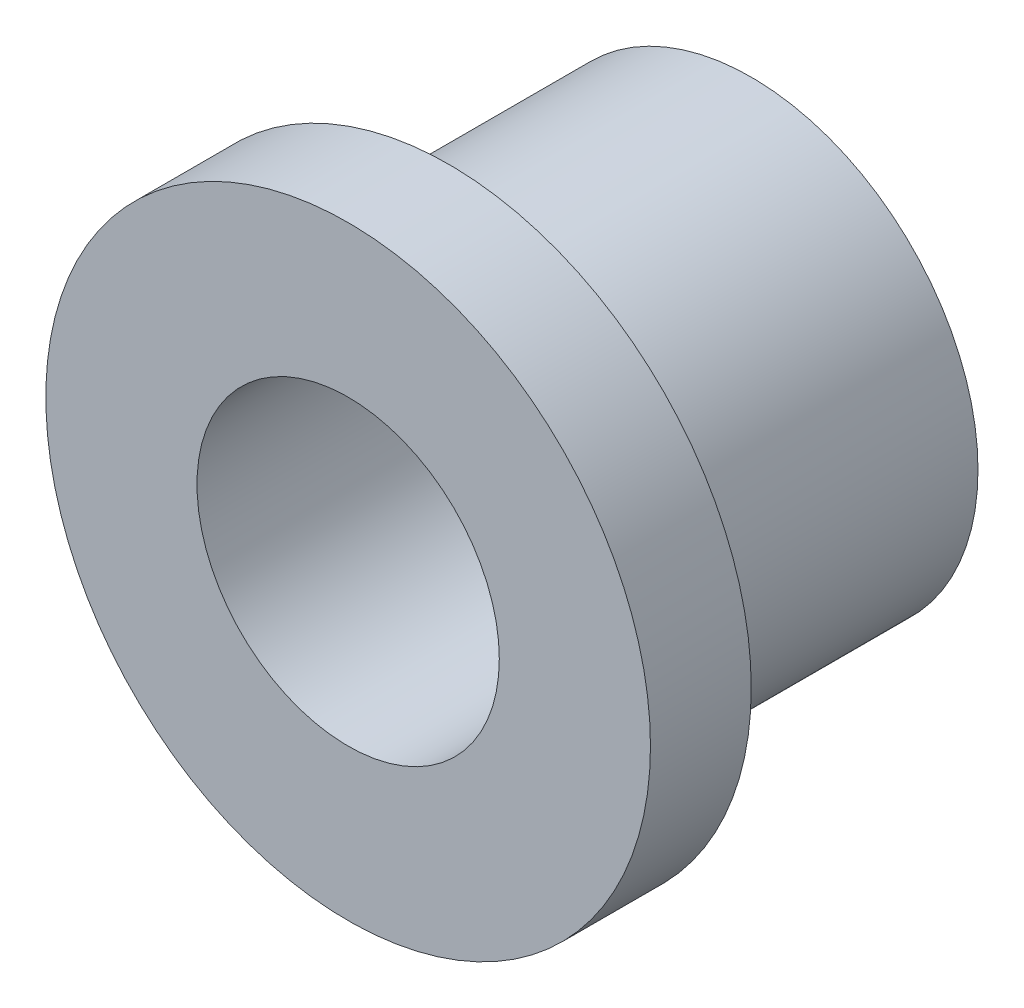
ISO-10303-21;
HEADER;
FILE_DESCRIPTION(('STEP AP214'),'2;1');
FILE_NAME('part.step','',(''),(''),'','','');
FILE_SCHEMA(('AUTOMOTIVE_DESIGN { 1 0 10303 214 1 1 1 1 }'));
ENDSEC;
DATA;
#1=APPLICATION_CONTEXT('core data for automotive mechanical design processes');
#2=APPLICATION_PROTOCOL_DEFINITION('international standard','automotive_design',2000,#1);
#3=PRODUCT_CONTEXT('',#1,'mechanical');
#4=PRODUCT('Part','Part','',(#3));
#5=PRODUCT_RELATED_PRODUCT_CATEGORY('part','',(#4));
#6=PRODUCT_DEFINITION_FORMATION('','',#4);
#7=PRODUCT_DEFINITION_CONTEXT('part definition',#1,'design');
#8=PRODUCT_DEFINITION('design','',#6,#7);
#9=PRODUCT_DEFINITION_SHAPE('','',#8);
#10=(LENGTH_UNIT() NAMED_UNIT(*) SI_UNIT(.MILLI.,.METRE.));
#11=(NAMED_UNIT(*) PLANE_ANGLE_UNIT() SI_UNIT($,.RADIAN.));
#12=(NAMED_UNIT(*) SI_UNIT($,.STERADIAN.) SOLID_ANGLE_UNIT());
#13=UNCERTAINTY_MEASURE_WITH_UNIT(LENGTH_MEASURE(1.E-05),#10,'distance_accuracy_value','');
#14=(GEOMETRIC_REPRESENTATION_CONTEXT(3) GLOBAL_UNCERTAINTY_ASSIGNED_CONTEXT((#13)) GLOBAL_UNIT_ASSIGNED_CONTEXT((#10,
#11,#12)) REPRESENTATION_CONTEXT('',''));
#15=CARTESIAN_POINT('',(0.,0.,0.));
#16=DIRECTION('',(0.,0.,1.));
#17=DIRECTION('',(1.,0.,0.));
#18=AXIS2_PLACEMENT_3D('',#15,#16,#17);
#19=CARTESIAN_POINT('',(0.,0.,8.));
#20=DIRECTION('',(0.,0.,-1.));
#21=DIRECTION('',(-1.,0.,0.));
#22=AXIS2_PLACEMENT_3D('',#19,#20,#21);
#23=CYLINDRICAL_SURFACE('',#22,4.5);
#24=CARTESIAN_POINT('',(0.,0.,0.));
#25=DIRECTION('',(0.,0.,1.));
#26=DIRECTION('',(1.,0.,0.));
#27=AXIS2_PLACEMENT_3D('',#24,#25,#26);
#28=CIRCLE('',#27,4.5);
#29=CARTESIAN_POINT('',(4.5,0.,0.));
#30=VERTEX_POINT('',#29);
#31=EDGE_CURVE('E47',#30,#30,#28,.T.);
#32=ORIENTED_EDGE('',*,*,#31,.T.);
#33=EDGE_LOOP('',(#32));
#34=FACE_BOUND('',#33,.T.);
#35=CARTESIAN_POINT('',(0.,0.,6.));
#36=DIRECTION('',(0.,0.,1.));
#37=DIRECTION('',(1.,0.,0.));
#38=AXIS2_PLACEMENT_3D('',#35,#36,#37);
#39=CIRCLE('',#38,4.5);
#40=CARTESIAN_POINT('',(4.5,0.,6.));
#41=VERTEX_POINT('',#40);
#42=EDGE_CURVE('E10',#41,#41,#39,.T.);
#43=ORIENTED_EDGE('',*,*,#42,.F.);
#44=EDGE_LOOP('',(#43));
#45=FACE_BOUND('',#44,.T.);
#46=ADVANCED_FACE('F41',(#34,#45),#23,.T.);
#47=CARTESIAN_POINT('',(0.,0.,8.));
#48=DIRECTION('',(0.,0.,1.));
#49=DIRECTION('',(1.,0.,0.));
#50=AXIS2_PLACEMENT_3D('',#47,#48,#49);
#51=PLANE('',#50);
#52=CARTESIAN_POINT('',(0.,0.,8.));
#53=DIRECTION('',(0.,0.,1.));
#54=DIRECTION('',(1.,0.,0.));
#55=AXIS2_PLACEMENT_3D('',#52,#53,#54);
#56=CIRCLE('',#55,3.);
#57=CARTESIAN_POINT('',(3.,0.,8.));
#58=VERTEX_POINT('',#57);
#59=EDGE_CURVE('E51',#58,#58,#56,.T.);
#60=ORIENTED_EDGE('',*,*,#59,.F.);
#61=EDGE_LOOP('',(#60));
#62=FACE_BOUND('',#61,.T.);
#63=CARTESIAN_POINT('',(0.,0.,8.));
#64=DIRECTION('',(0.,0.,1.));
#65=DIRECTION('',(1.,0.,0.));
#66=AXIS2_PLACEMENT_3D('',#63,#64,#65);
#67=CIRCLE('',#66,6.);
#68=CARTESIAN_POINT('',(6.,0.,8.));
#69=VERTEX_POINT('',#68);
#70=EDGE_CURVE('E61',#69,#69,#67,.T.);
#71=ORIENTED_EDGE('',*,*,#70,.T.);
#72=EDGE_LOOP('',(#71));
#73=FACE_BOUND('',#72,.T.);
#74=ADVANCED_FACE('F79',(#62,#73),#51,.T.);
#75=CARTESIAN_POINT('',(0.,0.,0.));
#76=DIRECTION('',(0.,0.,1.));
#77=DIRECTION('',(1.,0.,0.));
#78=AXIS2_PLACEMENT_3D('',#75,#76,#77);
#79=PLANE('',#78);
#80=ORIENTED_EDGE('',*,*,#31,.F.);
#81=EDGE_LOOP('',(#80));
#82=FACE_BOUND('',#81,.T.);
#83=CARTESIAN_POINT('',(0.,0.,0.));
#84=DIRECTION('',(0.,0.,1.));
#85=DIRECTION('',(1.,0.,0.));
#86=AXIS2_PLACEMENT_3D('',#83,#84,#85);
#87=CIRCLE('',#86,3.);
#88=CARTESIAN_POINT('',(3.,0.,0.));
#89=VERTEX_POINT('',#88);
#90=EDGE_CURVE('E55',#89,#89,#87,.T.);
#91=ORIENTED_EDGE('',*,*,#90,.T.);
#92=EDGE_LOOP('',(#91));
#93=FACE_BOUND('',#92,.T.);
#94=ADVANCED_FACE('F84',(#82,#93),#79,.F.);
#95=CARTESIAN_POINT('',(0.,0.,8.));
#96=DIRECTION('',(0.,0.,-1.));
#97=DIRECTION('',(-1.,0.,0.));
#98=AXIS2_PLACEMENT_3D('',#95,#96,#97);
#99=CYLINDRICAL_SURFACE('',#98,3.);
#100=ORIENTED_EDGE('',*,*,#59,.T.);
#101=EDGE_LOOP('',(#100));
#102=FACE_BOUND('',#101,.T.);
#103=ORIENTED_EDGE('',*,*,#90,.F.);
#104=EDGE_LOOP('',(#103));
#105=FACE_BOUND('',#104,.T.);
#106=ADVANCED_FACE('F76',(#102,#105),#99,.F.);
#107=CARTESIAN_POINT('',(0.,0.,6.));
#108=DIRECTION('',(0.,0.,1.));
#109=DIRECTION('',(1.,0.,0.));
#110=AXIS2_PLACEMENT_3D('',#107,#108,#109);
#111=CYLINDRICAL_SURFACE('',#110,6.);
#112=CARTESIAN_POINT('',(0.,0.,6.));
#113=DIRECTION('',(0.,0.,1.));
#114=DIRECTION('',(1.,0.,0.));
#115=AXIS2_PLACEMENT_3D('',#112,#113,#114);
#116=CIRCLE('',#115,6.);
#117=CARTESIAN_POINT('',(6.,0.,6.));
#118=VERTEX_POINT('',#117);
#119=EDGE_CURVE('E59',#118,#118,#116,.T.);
#120=ORIENTED_EDGE('',*,*,#119,.T.);
#121=EDGE_LOOP('',(#120));
#122=FACE_BOUND('',#121,.T.);
#123=ORIENTED_EDGE('',*,*,#70,.F.);
#124=EDGE_LOOP('',(#123));
#125=FACE_BOUND('',#124,.T.);
#126=ADVANCED_FACE('F67',(#122,#125),#111,.T.);
#127=CARTESIAN_POINT('',(0.,0.,6.));
#128=DIRECTION('',(0.,0.,1.));
#129=DIRECTION('',(1.,0.,0.));
#130=AXIS2_PLACEMENT_3D('',#127,#128,#129);
#131=PLANE('',#130);
#132=ORIENTED_EDGE('',*,*,#42,.T.);
#133=EDGE_LOOP('',(#132));
#134=FACE_BOUND('',#133,.T.);
#135=ORIENTED_EDGE('',*,*,#119,.F.);
#136=EDGE_LOOP('',(#135));
#137=FACE_BOUND('',#136,.T.);
#138=ADVANCED_FACE('F70',(#134,#137),#131,.F.);
#139=CLOSED_SHELL('',(#46,#74,#94,#106,#126,#138));
#140=MANIFOLD_SOLID_BREP('B2',#139);
#141=ADVANCED_BREP_SHAPE_REPRESENTATION('',(#18,#140),#14);
#142=SHAPE_DEFINITION_REPRESENTATION(#9,#141);
ENDSEC;
END-ISO-10303-21;
